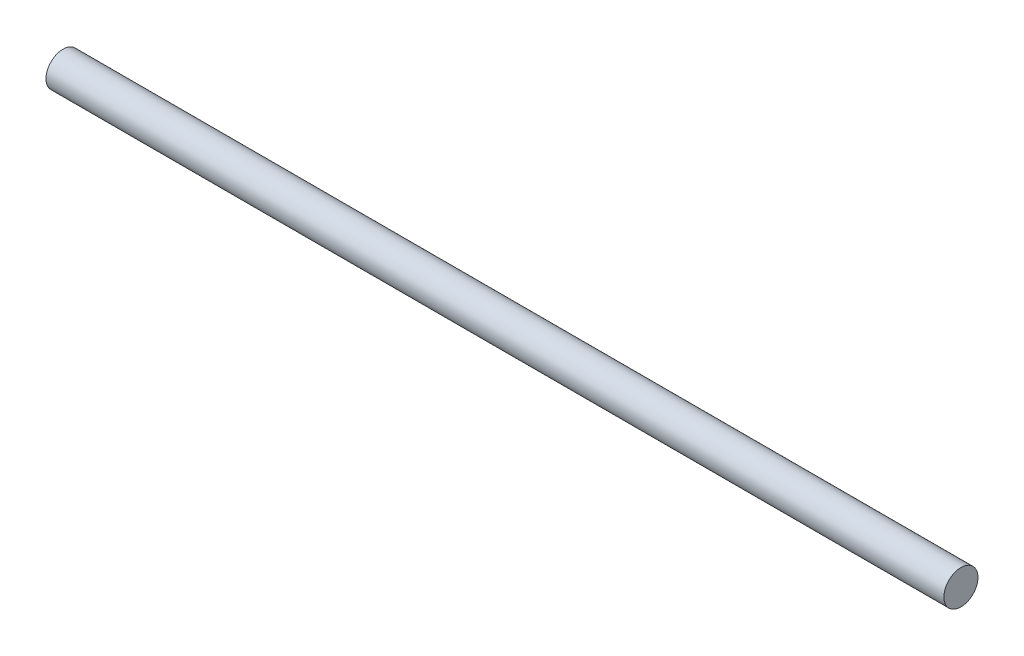
ISO-10303-21;
HEADER;
FILE_DESCRIPTION(('STEP AP214'),'2;1');
FILE_NAME('part.step','',(''),(''),'','','');
FILE_SCHEMA(('AUTOMOTIVE_DESIGN { 1 0 10303 214 1 1 1 1 }'));
ENDSEC;
DATA;
#1=APPLICATION_CONTEXT('core data for automotive mechanical design processes');
#2=APPLICATION_PROTOCOL_DEFINITION('international standard','automotive_design',2000,#1);
#3=PRODUCT_CONTEXT('',#1,'mechanical');
#4=PRODUCT('Part','Part','',(#3));
#5=PRODUCT_RELATED_PRODUCT_CATEGORY('part','',(#4));
#6=PRODUCT_DEFINITION_FORMATION('','',#4);
#7=PRODUCT_DEFINITION_CONTEXT('part definition',#1,'design');
#8=PRODUCT_DEFINITION('design','',#6,#7);
#9=PRODUCT_DEFINITION_SHAPE('','',#8);
#10=(LENGTH_UNIT() NAMED_UNIT(*) SI_UNIT(.MILLI.,.METRE.));
#11=(NAMED_UNIT(*) PLANE_ANGLE_UNIT() SI_UNIT($,.RADIAN.));
#12=(NAMED_UNIT(*) SI_UNIT($,.STERADIAN.) SOLID_ANGLE_UNIT());
#13=UNCERTAINTY_MEASURE_WITH_UNIT(LENGTH_MEASURE(1.E-05),#10,'distance_accuracy_value','');
#14=(GEOMETRIC_REPRESENTATION_CONTEXT(3) GLOBAL_UNCERTAINTY_ASSIGNED_CONTEXT((#13)) GLOBAL_UNIT_ASSIGNED_CONTEXT((#10,
#11,#12)) REPRESENTATION_CONTEXT('',''));
#15=CARTESIAN_POINT('',(0.,0.,0.));
#16=DIRECTION('',(0.,0.,1.));
#17=DIRECTION('',(1.,0.,0.));
#18=AXIS2_PLACEMENT_3D('',#15,#16,#17);
#19=CARTESIAN_POINT('',(1000.,0.,0.));
#20=DIRECTION('',(-1.,0.,0.));
#21=DIRECTION('',(0.,0.,1.));
#22=AXIS2_PLACEMENT_3D('',#19,#20,#21);
#23=CYLINDRICAL_SURFACE('',#22,19.);
#24=CARTESIAN_POINT('',(1000.,0.,0.));
#25=DIRECTION('',(1.,0.,0.));
#26=DIRECTION('',(0.,0.,-1.));
#27=AXIS2_PLACEMENT_3D('',#24,#25,#26);
#28=CIRCLE('',#27,19.);
#29=CARTESIAN_POINT('',(1000.,0.,-19.));
#30=VERTEX_POINT('',#29);
#31=EDGE_CURVE('E10',#30,#30,#28,.T.);
#32=ORIENTED_EDGE('',*,*,#31,.F.);
#33=EDGE_LOOP('',(#32));
#34=FACE_BOUND('',#33,.T.);
#35=CARTESIAN_POINT('',(0.,0.,0.));
#36=DIRECTION('',(1.,0.,0.));
#37=DIRECTION('',(0.,0.,-1.));
#38=AXIS2_PLACEMENT_3D('',#35,#36,#37);
#39=CIRCLE('',#38,19.);
#40=CARTESIAN_POINT('',(0.,0.,-19.));
#41=VERTEX_POINT('',#40);
#42=EDGE_CURVE('E40',#41,#41,#39,.T.);
#43=ORIENTED_EDGE('',*,*,#42,.T.);
#44=EDGE_LOOP('',(#43));
#45=FACE_BOUND('',#44,.T.);
#46=ADVANCED_FACE('F37',(#34,#45),#23,.T.);
#47=CARTESIAN_POINT('',(1000.,0.,0.));
#48=DIRECTION('',(1.,0.,0.));
#49=DIRECTION('',(0.,0.,-1.));
#50=AXIS2_PLACEMENT_3D('',#47,#48,#49);
#51=PLANE('',#50);
#52=ORIENTED_EDGE('',*,*,#31,.T.);
#53=EDGE_LOOP('',(#52));
#54=FACE_BOUND('',#53,.T.);
#55=ADVANCED_FACE('F54',(#54),#51,.T.);
#56=CARTESIAN_POINT('',(0.,0.,0.));
#57=DIRECTION('',(1.,0.,0.));
#58=DIRECTION('',(0.,0.,-1.));
#59=AXIS2_PLACEMENT_3D('',#56,#57,#58);
#60=PLANE('',#59);
#61=ORIENTED_EDGE('',*,*,#42,.F.);
#62=EDGE_LOOP('',(#61));
#63=FACE_BOUND('',#62,.T.);
#64=ADVANCED_FACE('F52',(#63),#60,.F.);
#65=CLOSED_SHELL('',(#46,#55,#64));
#66=MANIFOLD_SOLID_BREP('B2',#65);
#67=ADVANCED_BREP_SHAPE_REPRESENTATION('',(#18,#66),#14);
#68=SHAPE_DEFINITION_REPRESENTATION(#9,#67);
ENDSEC;
END-ISO-10303-21;
